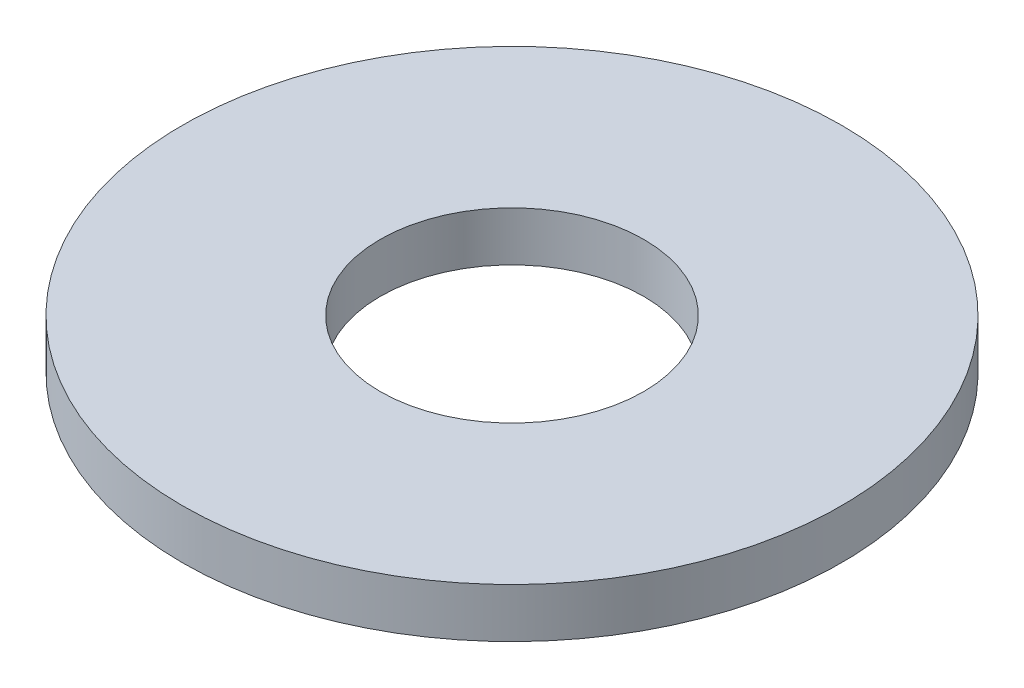
ISO-10303-21;
HEADER;
FILE_DESCRIPTION(('STEP AP214'),'2;1');
FILE_NAME('part.step','',(''),(''),'','','');
FILE_SCHEMA(('AUTOMOTIVE_DESIGN { 1 0 10303 214 1 1 1 1 }'));
ENDSEC;
DATA;
#1=APPLICATION_CONTEXT('core data for automotive mechanical design processes');
#2=APPLICATION_PROTOCOL_DEFINITION('international standard','automotive_design',2000,#1);
#3=PRODUCT_CONTEXT('',#1,'mechanical');
#4=PRODUCT('Part','Part','',(#3));
#5=PRODUCT_RELATED_PRODUCT_CATEGORY('part','',(#4));
#6=PRODUCT_DEFINITION_FORMATION('','',#4);
#7=PRODUCT_DEFINITION_CONTEXT('part definition',#1,'design');
#8=PRODUCT_DEFINITION('design','',#6,#7);
#9=PRODUCT_DEFINITION_SHAPE('','',#8);
#10=(LENGTH_UNIT() NAMED_UNIT(*) SI_UNIT(.MILLI.,.METRE.));
#11=(NAMED_UNIT(*) PLANE_ANGLE_UNIT() SI_UNIT($,.RADIAN.));
#12=(NAMED_UNIT(*) SI_UNIT($,.STERADIAN.) SOLID_ANGLE_UNIT());
#13=UNCERTAINTY_MEASURE_WITH_UNIT(LENGTH_MEASURE(1.E-05),#10,'distance_accuracy_value','');
#14=(GEOMETRIC_REPRESENTATION_CONTEXT(3) GLOBAL_UNCERTAINTY_ASSIGNED_CONTEXT((#13)) GLOBAL_UNIT_ASSIGNED_CONTEXT((#10,
#11,#12)) REPRESENTATION_CONTEXT('',''));
#15=CARTESIAN_POINT('',(0.,0.,0.));
#16=DIRECTION('',(0.,0.,1.));
#17=DIRECTION('',(1.,0.,0.));
#18=AXIS2_PLACEMENT_3D('',#15,#16,#17);
#19=CARTESIAN_POINT('',(0.,0.,0.));
#20=DIRECTION('',(0.,-1.,0.));
#21=DIRECTION('',(0.,0.,-1.));
#22=AXIS2_PLACEMENT_3D('',#19,#20,#21);
#23=CYLINDRICAL_SURFACE('',#22,0.8);
#24=CARTESIAN_POINT('',(0.,-0.15,0.));
#25=DIRECTION('',(0.,-1.,0.));
#26=DIRECTION('',(0.,0.,-1.));
#27=AXIS2_PLACEMENT_3D('',#24,#25,#26);
#28=CIRCLE('',#27,0.8);
#29=CARTESIAN_POINT('',(0.,-0.15,-0.8));
#30=VERTEX_POINT('',#29);
#31=EDGE_CURVE('E10',#30,#30,#28,.T.);
#32=ORIENTED_EDGE('',*,*,#31,.T.);
#33=EDGE_LOOP('',(#32));
#34=FACE_BOUND('',#33,.T.);
#35=CARTESIAN_POINT('',(0.,0.15,0.));
#36=DIRECTION('',(0.,-1.,0.));
#37=DIRECTION('',(0.,0.,-1.));
#38=AXIS2_PLACEMENT_3D('',#35,#36,#37);
#39=CIRCLE('',#38,0.8);
#40=CARTESIAN_POINT('',(0.,0.15,-0.8));
#41=VERTEX_POINT('',#40);
#42=EDGE_CURVE('E46',#41,#41,#39,.T.);
#43=ORIENTED_EDGE('',*,*,#42,.F.);
#44=EDGE_LOOP('',(#43));
#45=FACE_BOUND('',#44,.T.);
#46=ADVANCED_FACE('F32',(#34,#45),#23,.F.);
#47=CARTESIAN_POINT('',(0.,-0.15,-0.8));
#48=DIRECTION('',(0.,-1.,0.));
#49=DIRECTION('',(0.,0.,-1.));
#50=AXIS2_PLACEMENT_3D('',#47,#48,#49);
#51=PLANE('',#50);
#52=CARTESIAN_POINT('',(0.,-0.15,0.));
#53=DIRECTION('',(0.,-1.,0.));
#54=DIRECTION('',(0.,0.,-1.));
#55=AXIS2_PLACEMENT_3D('',#52,#53,#54);
#56=CIRCLE('',#55,2.);
#57=CARTESIAN_POINT('',(0.,-0.15,-2.));
#58=VERTEX_POINT('',#57);
#59=EDGE_CURVE('E38',#58,#58,#56,.T.);
#60=ORIENTED_EDGE('',*,*,#59,.T.);
#61=EDGE_LOOP('',(#60));
#62=FACE_BOUND('',#61,.T.);
#63=ORIENTED_EDGE('',*,*,#31,.F.);
#64=EDGE_LOOP('',(#63));
#65=FACE_BOUND('',#64,.T.);
#66=ADVANCED_FACE('F56',(#62,#65),#51,.T.);
#67=CARTESIAN_POINT('',(0.,0.,0.));
#68=DIRECTION('',(0.,-1.,0.));
#69=DIRECTION('',(0.,0.,-1.));
#70=AXIS2_PLACEMENT_3D('',#67,#68,#69);
#71=CYLINDRICAL_SURFACE('',#70,2.);
#72=CARTESIAN_POINT('',(0.,0.15,0.));
#73=DIRECTION('',(0.,-1.,0.));
#74=DIRECTION('',(0.,0.,-1.));
#75=AXIS2_PLACEMENT_3D('',#72,#73,#74);
#76=CIRCLE('',#75,2.);
#77=CARTESIAN_POINT('',(0.,0.15,-2.));
#78=VERTEX_POINT('',#77);
#79=EDGE_CURVE('E42',#78,#78,#76,.T.);
#80=ORIENTED_EDGE('',*,*,#79,.T.);
#81=EDGE_LOOP('',(#80));
#82=FACE_BOUND('',#81,.T.);
#83=ORIENTED_EDGE('',*,*,#59,.F.);
#84=EDGE_LOOP('',(#83));
#85=FACE_BOUND('',#84,.T.);
#86=ADVANCED_FACE('F60',(#82,#85),#71,.T.);
#87=CARTESIAN_POINT('',(0.,0.15,-0.8));
#88=DIRECTION('',(0.,1.,0.));
#89=DIRECTION('',(0.,0.,1.));
#90=AXIS2_PLACEMENT_3D('',#87,#88,#89);
#91=PLANE('',#90);
#92=ORIENTED_EDGE('',*,*,#42,.T.);
#93=EDGE_LOOP('',(#92));
#94=FACE_BOUND('',#93,.T.);
#95=ORIENTED_EDGE('',*,*,#79,.F.);
#96=EDGE_LOOP('',(#95));
#97=FACE_BOUND('',#96,.T.);
#98=ADVANCED_FACE('F52',(#94,#97),#91,.T.);
#99=CLOSED_SHELL('',(#46,#66,#86,#98));
#100=MANIFOLD_SOLID_BREP('B2',#99);
#101=ADVANCED_BREP_SHAPE_REPRESENTATION('',(#18,#100),#14);
#102=SHAPE_DEFINITION_REPRESENTATION(#9,#101);
ENDSEC;
END-ISO-10303-21;
